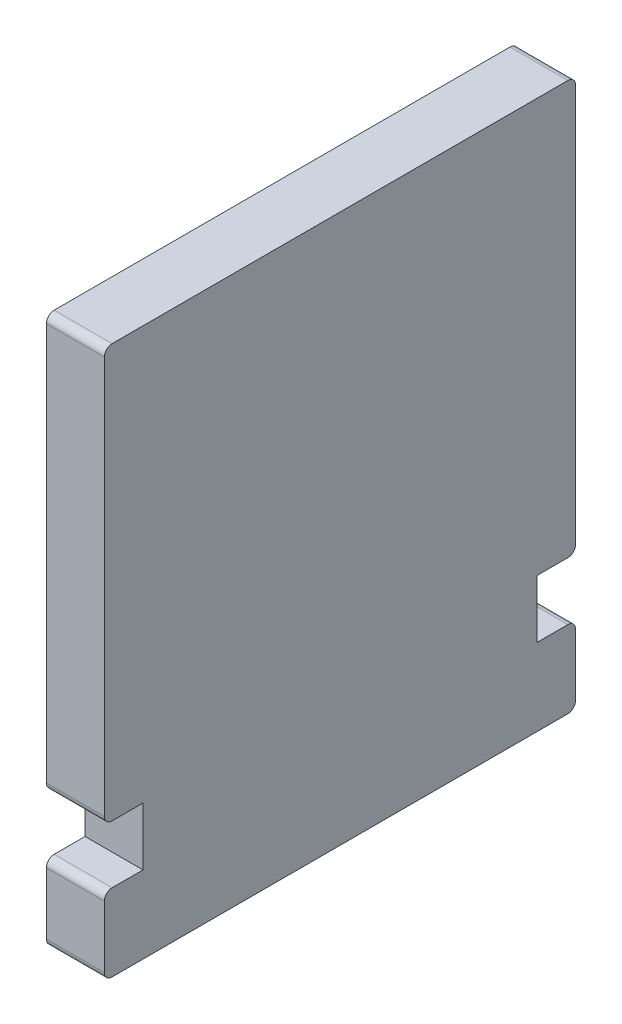
ISO-10303-21;
HEADER;
FILE_DESCRIPTION(('STEP AP214'),'2;1');
FILE_NAME('part.step','',(''),(''),'','','');
FILE_SCHEMA(('AUTOMOTIVE_DESIGN { 1 0 10303 214 1 1 1 1 }'));
ENDSEC;
DATA;
#1=APPLICATION_CONTEXT('core data for automotive mechanical design processes');
#2=APPLICATION_PROTOCOL_DEFINITION('international standard','automotive_design',2000,#1);
#3=PRODUCT_CONTEXT('',#1,'mechanical');
#4=PRODUCT('Part','Part','',(#3));
#5=PRODUCT_RELATED_PRODUCT_CATEGORY('part','',(#4));
#6=PRODUCT_DEFINITION_FORMATION('','',#4);
#7=PRODUCT_DEFINITION_CONTEXT('part definition',#1,'design');
#8=PRODUCT_DEFINITION('design','',#6,#7);
#9=PRODUCT_DEFINITION_SHAPE('','',#8);
#10=(LENGTH_UNIT() NAMED_UNIT(*) SI_UNIT(.MILLI.,.METRE.));
#11=(NAMED_UNIT(*) PLANE_ANGLE_UNIT() SI_UNIT($,.RADIAN.));
#12=(NAMED_UNIT(*) SI_UNIT($,.STERADIAN.) SOLID_ANGLE_UNIT());
#13=UNCERTAINTY_MEASURE_WITH_UNIT(LENGTH_MEASURE(1.E-05),#10,'distance_accuracy_value','');
#14=(GEOMETRIC_REPRESENTATION_CONTEXT(3) GLOBAL_UNCERTAINTY_ASSIGNED_CONTEXT((#13)) GLOBAL_UNIT_ASSIGNED_CONTEXT((#10,
#11,#12)) REPRESENTATION_CONTEXT('',''));
#15=CARTESIAN_POINT('',(0.,0.,0.));
#16=DIRECTION('',(0.,0.,1.));
#17=DIRECTION('',(1.,0.,0.));
#18=AXIS2_PLACEMENT_3D('',#15,#16,#17);
#19=CARTESIAN_POINT('',(0.,0.,0.));
#20=DIRECTION('',(0.,0.,-1.));
#21=DIRECTION('',(-1.,0.,0.));
#22=AXIS2_PLACEMENT_3D('',#19,#20,#21);
#23=PLANE('',#22);
#24=DIRECTION('',(0.,-1.,0.));
#25=VECTOR('',#24,1.);
#26=CARTESIAN_POINT('',(0.,0.,0.));
#27=LINE('',#26,#25);
#28=CARTESIAN_POINT('',(0.,14.,0.));
#29=VERTEX_POINT('',#28);
#30=CARTESIAN_POINT('',(0.,3.7,0.));
#31=VERTEX_POINT('',#30);
#32=EDGE_CURVE('E238',#29,#31,#27,.T.);
#33=ORIENTED_EDGE('',*,*,#32,.F.);
#34=DIRECTION('',(-1.,0.,0.));
#35=VECTOR('',#34,1.);
#36=CARTESIAN_POINT('',(1.5,14.,0.));
#37=LINE('',#36,#35);
#38=CARTESIAN_POINT('',(1.5,14.,0.));
#39=VERTEX_POINT('',#38);
#40=EDGE_CURVE('E276',#29,#39,#37,.F.);
#41=ORIENTED_EDGE('',*,*,#40,.T.);
#42=DIRECTION('',(0.,1.,0.));
#43=VECTOR('',#42,1.);
#44=CARTESIAN_POINT('',(1.5,0.,0.));
#45=LINE('',#44,#43);
#46=CARTESIAN_POINT('',(1.5,3.7,0.));
#47=VERTEX_POINT('',#46);
#48=EDGE_CURVE('E241',#47,#39,#45,.T.);
#49=ORIENTED_EDGE('',*,*,#48,.F.);
#50=DIRECTION('',(-1.,0.,0.));
#51=VECTOR('',#50,1.);
#52=CARTESIAN_POINT('',(0.,3.7,0.));
#53=LINE('',#52,#51);
#54=EDGE_CURVE('E273',#47,#31,#53,.T.);
#55=ORIENTED_EDGE('',*,*,#54,.T.);
#56=EDGE_LOOP('',(#33,#41,#49,#55));
#57=FACE_BOUND('',#56,.T.);
#58=ADVANCED_FACE('F35',(#57),#23,.T.);
#59=CARTESIAN_POINT('',(0.,0.,12.2));
#60=DIRECTION('',(0.,0.,-1.));
#61=DIRECTION('',(-1.,0.,0.));
#62=AXIS2_PLACEMENT_3D('',#59,#60,#61);
#63=PLANE('',#62);
#64=DIRECTION('',(0.,1.,0.));
#65=VECTOR('',#64,1.);
#66=CARTESIAN_POINT('',(1.5,0.,12.2));
#67=LINE('',#66,#65);
#68=CARTESIAN_POINT('',(1.5,3.7,12.2));
#69=VERTEX_POINT('',#68);
#70=CARTESIAN_POINT('',(1.5,14.,12.2));
#71=VERTEX_POINT('',#70);
#72=EDGE_CURVE('E230',#69,#71,#67,.T.);
#73=ORIENTED_EDGE('',*,*,#72,.T.);
#74=DIRECTION('',(-1.,0.,0.));
#75=VECTOR('',#74,1.);
#76=CARTESIAN_POINT('',(0.,14.,12.2));
#77=LINE('',#76,#75);
#78=CARTESIAN_POINT('',(0.,14.,12.2));
#79=VERTEX_POINT('',#78);
#80=EDGE_CURVE('E307',#71,#79,#77,.T.);
#81=ORIENTED_EDGE('',*,*,#80,.T.);
#82=DIRECTION('',(0.,-1.,0.));
#83=VECTOR('',#82,1.);
#84=CARTESIAN_POINT('',(0.,0.,12.2));
#85=LINE('',#84,#83);
#86=CARTESIAN_POINT('',(0.,3.7,12.2));
#87=VERTEX_POINT('',#86);
#88=EDGE_CURVE('E227',#79,#87,#85,.T.);
#89=ORIENTED_EDGE('',*,*,#88,.T.);
#90=DIRECTION('',(-1.,0.,0.));
#91=VECTOR('',#90,1.);
#92=CARTESIAN_POINT('',(0.,3.7,12.2));
#93=LINE('',#92,#91);
#94=EDGE_CURVE('E305',#87,#69,#93,.F.);
#95=ORIENTED_EDGE('',*,*,#94,.T.);
#96=EDGE_LOOP('',(#73,#81,#89,#95));
#97=FACE_BOUND('',#96,.T.);
#98=ADVANCED_FACE('F352',(#97),#63,.F.);
#99=CARTESIAN_POINT('',(0.,0.,12.2));
#100=DIRECTION('',(1.,0.,0.));
#101=DIRECTION('',(0.,0.,-1.));
#102=AXIS2_PLACEMENT_3D('',#99,#100,#101);
#103=PLANE('',#102);
#104=DIRECTION('',(0.,0.,-1.));
#105=VECTOR('',#104,1.);
#106=CARTESIAN_POINT('',(0.,14.2,12.2));
#107=LINE('',#106,#105);
#108=CARTESIAN_POINT('',(0.,14.2,12.));
#109=VERTEX_POINT('',#108);
#110=CARTESIAN_POINT('',(0.,14.2,0.200000000000001));
#111=VERTEX_POINT('',#110);
#112=EDGE_CURVE('E235',#109,#111,#107,.T.);
#113=ORIENTED_EDGE('',*,*,#112,.T.);
#114=CARTESIAN_POINT('',(0.,14.,0.200000000000001));
#115=DIRECTION('',(1.,0.,0.));
#116=DIRECTION('',(0.,0.,-1.));
#117=AXIS2_PLACEMENT_3D('',#114,#115,#116);
#118=CIRCLE('',#117,0.2);
#119=EDGE_CURVE('E271',#111,#29,#118,.F.);
#120=ORIENTED_EDGE('',*,*,#119,.T.);
#121=ORIENTED_EDGE('',*,*,#32,.T.);
#122=CARTESIAN_POINT('',(0.,3.7,0.2));
#123=DIRECTION('',(1.,0.,0.));
#124=DIRECTION('',(0.,0.,-1.));
#125=AXIS2_PLACEMENT_3D('',#122,#123,#124);
#126=CIRCLE('',#125,0.2);
#127=CARTESIAN_POINT('',(0.,3.5,0.2));
#128=VERTEX_POINT('',#127);
#129=EDGE_CURVE('E269',#31,#128,#126,.F.);
#130=ORIENTED_EDGE('',*,*,#129,.T.);
#131=DIRECTION('',(0.,0.,-1.));
#132=VECTOR('',#131,1.);
#133=CARTESIAN_POINT('',(0.,3.5,1.));
#134=LINE('',#133,#132);
#135=CARTESIAN_POINT('',(0.,3.5,1.));
#136=VERTEX_POINT('',#135);
#137=EDGE_CURVE('E197',#136,#128,#134,.T.);
#138=ORIENTED_EDGE('',*,*,#137,.F.);
#139=DIRECTION('',(0.,1.,0.));
#140=VECTOR('',#139,1.);
#141=CARTESIAN_POINT('',(0.,3.5,1.));
#142=LINE('',#141,#140);
#143=CARTESIAN_POINT('',(0.,2.,1.));
#144=VERTEX_POINT('',#143);
#145=EDGE_CURVE('E187',#144,#136,#142,.T.);
#146=ORIENTED_EDGE('',*,*,#145,.F.);
#147=DIRECTION('',(0.,0.,1.));
#148=VECTOR('',#147,1.);
#149=CARTESIAN_POINT('',(0.,2.,1.));
#150=LINE('',#149,#148);
#151=CARTESIAN_POINT('',(0.,2.,0.2));
#152=VERTEX_POINT('',#151);
#153=EDGE_CURVE('E172',#152,#144,#150,.T.);
#154=ORIENTED_EDGE('',*,*,#153,.F.);
#155=CARTESIAN_POINT('',(0.,1.8,0.2));
#156=DIRECTION('',(1.,0.,0.));
#157=DIRECTION('',(0.,0.,-1.));
#158=AXIS2_PLACEMENT_3D('',#155,#156,#157);
#159=CIRCLE('',#158,0.2);
#160=CARTESIAN_POINT('',(0.,1.8,0.));
#161=VERTEX_POINT('',#160);
#162=EDGE_CURVE('E267',#152,#161,#159,.F.);
#163=ORIENTED_EDGE('',*,*,#162,.T.);
#164=CARTESIAN_POINT('',(0.,0.2,0.));
#165=VERTEX_POINT('',#164);
#166=EDGE_CURVE('E226',#161,#165,#27,.T.);
#167=ORIENTED_EDGE('',*,*,#166,.T.);
#168=CARTESIAN_POINT('',(0.,0.2,0.200000000000001));
#169=DIRECTION('',(1.,0.,0.));
#170=DIRECTION('',(0.,0.,-1.));
#171=AXIS2_PLACEMENT_3D('',#168,#169,#170);
#172=CIRCLE('',#171,0.2);
#173=CARTESIAN_POINT('',(0.,0.,0.200000000000001));
#174=VERTEX_POINT('',#173);
#175=EDGE_CURVE('E265',#165,#174,#172,.F.);
#176=ORIENTED_EDGE('',*,*,#175,.T.);
#177=DIRECTION('',(0.,0.,-1.));
#178=VECTOR('',#177,1.);
#179=CARTESIAN_POINT('',(0.,0.,12.2));
#180=LINE('',#179,#178);
#181=CARTESIAN_POINT('',(0.,0.,12.));
#182=VERTEX_POINT('',#181);
#183=EDGE_CURVE('E249',#182,#174,#180,.T.);
#184=ORIENTED_EDGE('',*,*,#183,.F.);
#185=CARTESIAN_POINT('',(0.,0.2,12.));
#186=DIRECTION('',(1.,0.,0.));
#187=DIRECTION('',(0.,0.,-1.));
#188=AXIS2_PLACEMENT_3D('',#185,#186,#187);
#189=CIRCLE('',#188,0.2);
#190=CARTESIAN_POINT('',(0.,0.2,12.2));
#191=VERTEX_POINT('',#190);
#192=EDGE_CURVE('E257',#182,#191,#189,.F.);
#193=ORIENTED_EDGE('',*,*,#192,.T.);
#194=CARTESIAN_POINT('',(0.,1.8,12.2));
#195=VERTEX_POINT('',#194);
#196=EDGE_CURVE('E231',#195,#191,#85,.T.);
#197=ORIENTED_EDGE('',*,*,#196,.F.);
#198=CARTESIAN_POINT('',(0.,1.8,12.));
#199=DIRECTION('',(1.,0.,0.));
#200=DIRECTION('',(0.,0.,-1.));
#201=AXIS2_PLACEMENT_3D('',#198,#199,#200);
#202=CIRCLE('',#201,0.2);
#203=CARTESIAN_POINT('',(0.,2.,12.));
#204=VERTEX_POINT('',#203);
#205=EDGE_CURVE('E261',#195,#204,#202,.F.);
#206=ORIENTED_EDGE('',*,*,#205,.T.);
#207=DIRECTION('',(0.,0.,1.));
#208=VECTOR('',#207,1.);
#209=CARTESIAN_POINT('',(0.,2.,13.7974919074563));
#210=LINE('',#209,#208);
#211=CARTESIAN_POINT('',(0.,2.,11.2));
#212=VERTEX_POINT('',#211);
#213=EDGE_CURVE('E221',#212,#204,#210,.T.);
#214=ORIENTED_EDGE('',*,*,#213,.F.);
#215=DIRECTION('',(0.,-1.,0.));
#216=VECTOR('',#215,1.);
#217=CARTESIAN_POINT('',(0.,3.5,11.2));
#218=LINE('',#217,#216);
#219=CARTESIAN_POINT('',(0.,3.5,11.2));
#220=VERTEX_POINT('',#219);
#221=EDGE_CURVE('E181',#220,#212,#218,.T.);
#222=ORIENTED_EDGE('',*,*,#221,.F.);
#223=DIRECTION('',(0.,0.,-1.));
#224=VECTOR('',#223,1.);
#225=CARTESIAN_POINT('',(0.,3.5,13.7974919074563));
#226=LINE('',#225,#224);
#227=CARTESIAN_POINT('',(0.,3.5,12.));
#228=VERTEX_POINT('',#227);
#229=EDGE_CURVE('E208',#228,#220,#226,.T.);
#230=ORIENTED_EDGE('',*,*,#229,.F.);
#231=CARTESIAN_POINT('',(0.,3.7,12.));
#232=DIRECTION('',(1.,0.,0.));
#233=DIRECTION('',(0.,0.,-1.));
#234=AXIS2_PLACEMENT_3D('',#231,#232,#233);
#235=CIRCLE('',#234,0.2);
#236=EDGE_CURVE('E259',#228,#87,#235,.F.);
#237=ORIENTED_EDGE('',*,*,#236,.T.);
#238=ORIENTED_EDGE('',*,*,#88,.F.);
#239=CARTESIAN_POINT('',(0.,14.,12.));
#240=DIRECTION('',(1.,0.,0.));
#241=DIRECTION('',(0.,0.,-1.));
#242=AXIS2_PLACEMENT_3D('',#239,#240,#241);
#243=CIRCLE('',#242,0.2);
#244=EDGE_CURVE('E263',#79,#109,#243,.F.);
#245=ORIENTED_EDGE('',*,*,#244,.T.);
#246=EDGE_LOOP('',(#113,#120,#121,#130,#138,#146,#154,#163,#167,#176,#184,#193,#197,#206,#214,
#222,#230,#237,#238,#245));
#247=FACE_BOUND('',#246,.T.);
#248=ADVANCED_FACE('F195',(#247),#103,.F.);
#249=CARTESIAN_POINT('',(0.,0.,12.2));
#250=DIRECTION('',(0.,1.,0.));
#251=DIRECTION('',(0.,0.,1.));
#252=AXIS2_PLACEMENT_3D('',#249,#250,#251);
#253=PLANE('',#252);
#254=ORIENTED_EDGE('',*,*,#183,.T.);
#255=DIRECTION('',(1.,0.,0.));
#256=VECTOR('',#255,1.);
#257=CARTESIAN_POINT('',(1.5,0.,0.200000000000001));
#258=LINE('',#257,#256);
#259=CARTESIAN_POINT('',(1.5,0.,0.200000000000001));
#260=VERTEX_POINT('',#259);
#261=EDGE_CURVE('E302',#174,#260,#258,.T.);
#262=ORIENTED_EDGE('',*,*,#261,.T.);
#263=DIRECTION('',(0.,0.,-1.));
#264=VECTOR('',#263,1.);
#265=CARTESIAN_POINT('',(1.5,0.,12.2));
#266=LINE('',#265,#264);
#267=CARTESIAN_POINT('',(1.5,0.,12.));
#268=VERTEX_POINT('',#267);
#269=EDGE_CURVE('E246',#268,#260,#266,.T.);
#270=ORIENTED_EDGE('',*,*,#269,.F.);
#271=DIRECTION('',(1.,0.,0.));
#272=VECTOR('',#271,1.);
#273=CARTESIAN_POINT('',(0.,0.,12.));
#274=LINE('',#273,#272);
#275=EDGE_CURVE('E300',#268,#182,#274,.F.);
#276=ORIENTED_EDGE('',*,*,#275,.T.);
#277=EDGE_LOOP('',(#254,#262,#270,#276));
#278=FACE_BOUND('',#277,.T.);
#279=ADVANCED_FACE('F390',(#278),#253,.F.);
#280=CARTESIAN_POINT('',(1.5,0.,12.2));
#281=DIRECTION('',(-1.,0.,0.));
#282=DIRECTION('',(0.,0.,1.));
#283=AXIS2_PLACEMENT_3D('',#280,#281,#282);
#284=PLANE('',#283);
#285=ORIENTED_EDGE('',*,*,#48,.T.);
#286=CARTESIAN_POINT('',(1.5,14.,0.200000000000001));
#287=DIRECTION('',(-1.,0.,0.));
#288=DIRECTION('',(0.,0.,1.));
#289=AXIS2_PLACEMENT_3D('',#286,#287,#288);
#290=CIRCLE('',#289,0.2);
#291=CARTESIAN_POINT('',(1.5,14.2,0.200000000000001));
#292=VERTEX_POINT('',#291);
#293=EDGE_CURVE('E291',#39,#292,#290,.F.);
#294=ORIENTED_EDGE('',*,*,#293,.T.);
#295=DIRECTION('',(0.,0.,-1.));
#296=VECTOR('',#295,1.);
#297=CARTESIAN_POINT('',(1.5,14.2,12.2));
#298=LINE('',#297,#296);
#299=CARTESIAN_POINT('',(1.5,14.2,12.));
#300=VERTEX_POINT('',#299);
#301=EDGE_CURVE('E243',#300,#292,#298,.T.);
#302=ORIENTED_EDGE('',*,*,#301,.F.);
#303=CARTESIAN_POINT('',(1.5,14.,12.));
#304=DIRECTION('',(-1.,0.,0.));
#305=DIRECTION('',(0.,0.,1.));
#306=AXIS2_PLACEMENT_3D('',#303,#304,#305);
#307=CIRCLE('',#306,0.2);
#308=EDGE_CURVE('E284',#300,#71,#307,.F.);
#309=ORIENTED_EDGE('',*,*,#308,.T.);
#310=ORIENTED_EDGE('',*,*,#72,.F.);
#311=CARTESIAN_POINT('',(1.5,3.7,12.));
#312=DIRECTION('',(-1.,0.,0.));
#313=DIRECTION('',(0.,0.,1.));
#314=AXIS2_PLACEMENT_3D('',#311,#312,#313);
#315=CIRCLE('',#314,0.2);
#316=CARTESIAN_POINT('',(1.5,3.5,12.));
#317=VERTEX_POINT('',#316);
#318=EDGE_CURVE('E280',#69,#317,#315,.F.);
#319=ORIENTED_EDGE('',*,*,#318,.T.);
#320=DIRECTION('',(0.,0.,1.));
#321=VECTOR('',#320,1.);
#322=CARTESIAN_POINT('',(1.5,3.5,13.7974919074563));
#323=LINE('',#322,#321);
#324=CARTESIAN_POINT('',(1.5,3.5,11.2));
#325=VERTEX_POINT('',#324);
#326=EDGE_CURVE('E215',#325,#317,#323,.T.);
#327=ORIENTED_EDGE('',*,*,#326,.F.);
#328=DIRECTION('',(0.,1.,0.));
#329=VECTOR('',#328,1.);
#330=CARTESIAN_POINT('',(1.5,3.5,11.2));
#331=LINE('',#330,#329);
#332=CARTESIAN_POINT('',(1.5,2.,11.2));
#333=VERTEX_POINT('',#332);
#334=EDGE_CURVE('E212',#333,#325,#331,.T.);
#335=ORIENTED_EDGE('',*,*,#334,.F.);
#336=DIRECTION('',(0.,0.,-1.));
#337=VECTOR('',#336,1.);
#338=CARTESIAN_POINT('',(1.5,2.,13.7974919074563));
#339=LINE('',#338,#337);
#340=CARTESIAN_POINT('',(1.5,2.,12.));
#341=VERTEX_POINT('',#340);
#342=EDGE_CURVE('E210',#341,#333,#339,.T.);
#343=ORIENTED_EDGE('',*,*,#342,.F.);
#344=CARTESIAN_POINT('',(1.5,1.8,12.));
#345=DIRECTION('',(-1.,0.,0.));
#346=DIRECTION('',(0.,0.,1.));
#347=AXIS2_PLACEMENT_3D('',#344,#345,#346);
#348=CIRCLE('',#347,0.2);
#349=CARTESIAN_POINT('',(1.5,1.8,12.2));
#350=VERTEX_POINT('',#349);
#351=EDGE_CURVE('E282',#341,#350,#348,.F.);
#352=ORIENTED_EDGE('',*,*,#351,.T.);
#353=CARTESIAN_POINT('',(1.5,0.2,12.2));
#354=VERTEX_POINT('',#353);
#355=EDGE_CURVE('E232',#354,#350,#67,.T.);
#356=ORIENTED_EDGE('',*,*,#355,.F.);
#357=CARTESIAN_POINT('',(1.5,0.2,12.));
#358=DIRECTION('',(-1.,0.,0.));
#359=DIRECTION('',(0.,0.,1.));
#360=AXIS2_PLACEMENT_3D('',#357,#358,#359);
#361=CIRCLE('',#360,0.2);
#362=EDGE_CURVE('E278',#354,#268,#361,.F.);
#363=ORIENTED_EDGE('',*,*,#362,.T.);
#364=ORIENTED_EDGE('',*,*,#269,.T.);
#365=CARTESIAN_POINT('',(1.5,0.2,0.200000000000001));
#366=DIRECTION('',(-1.,0.,0.));
#367=DIRECTION('',(0.,0.,1.));
#368=AXIS2_PLACEMENT_3D('',#365,#366,#367);
#369=CIRCLE('',#368,0.2);
#370=CARTESIAN_POINT('',(1.5,0.2,0.));
#371=VERTEX_POINT('',#370);
#372=EDGE_CURVE('E286',#260,#371,#369,.F.);
#373=ORIENTED_EDGE('',*,*,#372,.T.);
#374=CARTESIAN_POINT('',(1.5,1.8,0.));
#375=VERTEX_POINT('',#374);
#376=EDGE_CURVE('E239',#371,#375,#45,.T.);
#377=ORIENTED_EDGE('',*,*,#376,.T.);
#378=CARTESIAN_POINT('',(1.5,1.8,0.2));
#379=DIRECTION('',(-1.,0.,0.));
#380=DIRECTION('',(0.,0.,1.));
#381=AXIS2_PLACEMENT_3D('',#378,#379,#380);
#382=CIRCLE('',#381,0.2);
#383=CARTESIAN_POINT('',(1.5,2.,0.2));
#384=VERTEX_POINT('',#383);
#385=EDGE_CURVE('E50',#375,#384,#382,.F.);
#386=ORIENTED_EDGE('',*,*,#385,.T.);
#387=DIRECTION('',(0.,0.,-1.));
#388=VECTOR('',#387,1.);
#389=CARTESIAN_POINT('',(1.5,2.,1.));
#390=LINE('',#389,#388);
#391=CARTESIAN_POINT('',(1.5,2.,1.));
#392=VERTEX_POINT('',#391);
#393=EDGE_CURVE('E202',#392,#384,#390,.T.);
#394=ORIENTED_EDGE('',*,*,#393,.F.);
#395=DIRECTION('',(0.,-1.,0.));
#396=VECTOR('',#395,1.);
#397=CARTESIAN_POINT('',(1.5,3.5,1.));
#398=LINE('',#397,#396);
#399=CARTESIAN_POINT('',(1.5,3.5,1.));
#400=VERTEX_POINT('',#399);
#401=EDGE_CURVE('E190',#400,#392,#398,.T.);
#402=ORIENTED_EDGE('',*,*,#401,.F.);
#403=DIRECTION('',(0.,0.,1.));
#404=VECTOR('',#403,1.);
#405=CARTESIAN_POINT('',(1.5,3.5,1.));
#406=LINE('',#405,#404);
#407=CARTESIAN_POINT('',(1.5,3.5,0.2));
#408=VERTEX_POINT('',#407);
#409=EDGE_CURVE('E191',#408,#400,#406,.T.);
#410=ORIENTED_EDGE('',*,*,#409,.F.);
#411=CARTESIAN_POINT('',(1.5,3.7,0.2));
#412=DIRECTION('',(-1.,0.,0.));
#413=DIRECTION('',(0.,0.,1.));
#414=AXIS2_PLACEMENT_3D('',#411,#412,#413);
#415=CIRCLE('',#414,0.2);
#416=EDGE_CURVE('E289',#408,#47,#415,.F.);
#417=ORIENTED_EDGE('',*,*,#416,.T.);
#418=EDGE_LOOP('',(#285,#294,#302,#309,#310,#319,#327,#335,#343,#352,#356,#363,#364,#373,#377,
#386,#394,#402,#410,#417));
#419=FACE_BOUND('',#418,.T.);
#420=ADVANCED_FACE('F334',(#419),#284,.F.);
#421=CARTESIAN_POINT('',(0.,14.2,12.2));
#422=DIRECTION('',(0.,-1.,0.));
#423=DIRECTION('',(0.,0.,-1.));
#424=AXIS2_PLACEMENT_3D('',#421,#422,#423);
#425=PLANE('',#424);
#426=ORIENTED_EDGE('',*,*,#301,.T.);
#427=DIRECTION('',(-1.,0.,0.));
#428=VECTOR('',#427,1.);
#429=CARTESIAN_POINT('',(0.,14.2,0.200000000000001));
#430=LINE('',#429,#428);
#431=EDGE_CURVE('E254',#292,#111,#430,.T.);
#432=ORIENTED_EDGE('',*,*,#431,.T.);
#433=ORIENTED_EDGE('',*,*,#112,.F.);
#434=DIRECTION('',(-1.,0.,0.));
#435=VECTOR('',#434,1.);
#436=CARTESIAN_POINT('',(0.,14.2,12.));
#437=LINE('',#436,#435);
#438=EDGE_CURVE('E252',#109,#300,#437,.F.);
#439=ORIENTED_EDGE('',*,*,#438,.T.);
#440=EDGE_LOOP('',(#426,#432,#433,#439));
#441=FACE_BOUND('',#440,.T.);
#442=ADVANCED_FACE('F361',(#441),#425,.F.);
#443=ORIENTED_EDGE('',*,*,#355,.T.);
#444=DIRECTION('',(1.,0.,0.));
#445=VECTOR('',#444,1.);
#446=CARTESIAN_POINT('',(0.,1.8,12.2));
#447=LINE('',#446,#445);
#448=EDGE_CURVE('E43',#350,#195,#447,.F.);
#449=ORIENTED_EDGE('',*,*,#448,.T.);
#450=ORIENTED_EDGE('',*,*,#196,.T.);
#451=DIRECTION('',(1.,0.,0.));
#452=VECTOR('',#451,1.);
#453=CARTESIAN_POINT('',(0.,0.2,12.2));
#454=LINE('',#453,#452);
#455=EDGE_CURVE('E313',#191,#354,#454,.T.);
#456=ORIENTED_EDGE('',*,*,#455,.T.);
#457=EDGE_LOOP('',(#443,#449,#450,#456));
#458=FACE_BOUND('',#457,.T.);
#459=ADVANCED_FACE('F319',(#458),#63,.F.);
#460=ORIENTED_EDGE('',*,*,#166,.F.);
#461=DIRECTION('',(1.,0.,0.));
#462=VECTOR('',#461,1.);
#463=CARTESIAN_POINT('',(1.5,1.8,0.));
#464=LINE('',#463,#462);
#465=EDGE_CURVE('E297',#161,#375,#464,.T.);
#466=ORIENTED_EDGE('',*,*,#465,.T.);
#467=ORIENTED_EDGE('',*,*,#376,.F.);
#468=DIRECTION('',(1.,0.,0.));
#469=VECTOR('',#468,1.);
#470=CARTESIAN_POINT('',(0.,0.2,0.));
#471=LINE('',#470,#469);
#472=EDGE_CURVE('E295',#371,#165,#471,.F.);
#473=ORIENTED_EDGE('',*,*,#472,.T.);
#474=EDGE_LOOP('',(#460,#466,#467,#473));
#475=FACE_BOUND('',#474,.T.);
#476=ADVANCED_FACE('F383',(#475),#23,.T.);
#477=CARTESIAN_POINT('',(-0.000999999999999916,3.5,13.7974919074563));
#478=DIRECTION('',(0.,1.,0.));
#479=DIRECTION('',(0.,0.,1.));
#480=AXIS2_PLACEMENT_3D('',#477,#478,#479);
#481=PLANE('',#480);
#482=ORIENTED_EDGE('',*,*,#326,.T.);
#483=DIRECTION('',(-1.,0.,0.));
#484=VECTOR('',#483,1.);
#485=CARTESIAN_POINT('',(-0.000999999999999916,3.5,12.));
#486=LINE('',#485,#484);
#487=EDGE_CURVE('E11',#317,#228,#486,.T.);
#488=ORIENTED_EDGE('',*,*,#487,.T.);
#489=ORIENTED_EDGE('',*,*,#229,.T.);
#490=DIRECTION('',(1.,0.,0.));
#491=VECTOR('',#490,1.);
#492=CARTESIAN_POINT('',(-0.000999999999999916,3.5,11.2));
#493=LINE('',#492,#491);
#494=EDGE_CURVE('E219',#220,#325,#493,.T.);
#495=ORIENTED_EDGE('',*,*,#494,.T.);
#496=EDGE_LOOP('',(#482,#488,#489,#495));
#497=FACE_BOUND('',#496,.T.);
#498=ADVANCED_FACE('F343',(#497),#481,.F.);
#499=CARTESIAN_POINT('',(-0.000999999999999916,3.5,11.2));
#500=DIRECTION('',(0.,0.,-1.));
#501=DIRECTION('',(-1.,0.,0.));
#502=AXIS2_PLACEMENT_3D('',#499,#500,#501);
#503=PLANE('',#502);
#504=ORIENTED_EDGE('',*,*,#221,.T.);
#505=DIRECTION('',(1.,0.,0.));
#506=VECTOR('',#505,1.);
#507=CARTESIAN_POINT('',(-0.000999999999999916,2.,11.2));
#508=LINE('',#507,#506);
#509=EDGE_CURVE('E218',#212,#333,#508,.T.);
#510=ORIENTED_EDGE('',*,*,#509,.T.);
#511=ORIENTED_EDGE('',*,*,#334,.T.);
#512=ORIENTED_EDGE('',*,*,#494,.F.);
#513=EDGE_LOOP('',(#504,#510,#511,#512));
#514=FACE_BOUND('',#513,.T.);
#515=ADVANCED_FACE('F338',(#514),#503,.F.);
#516=CARTESIAN_POINT('',(-0.000999999999999916,2.,13.7974919074563));
#517=DIRECTION('',(0.,-1.,0.));
#518=DIRECTION('',(0.,0.,-1.));
#519=AXIS2_PLACEMENT_3D('',#516,#517,#518);
#520=PLANE('',#519);
#521=ORIENTED_EDGE('',*,*,#213,.T.);
#522=DIRECTION('',(1.,0.,0.));
#523=VECTOR('',#522,1.);
#524=CARTESIAN_POINT('',(-0.000999999999999916,2.,12.));
#525=LINE('',#524,#523);
#526=EDGE_CURVE('E310',#204,#341,#525,.T.);
#527=ORIENTED_EDGE('',*,*,#526,.T.);
#528=ORIENTED_EDGE('',*,*,#342,.T.);
#529=ORIENTED_EDGE('',*,*,#509,.F.);
#530=EDGE_LOOP('',(#521,#527,#528,#529));
#531=FACE_BOUND('',#530,.T.);
#532=ADVANCED_FACE('F331',(#531),#520,.F.);
#533=CARTESIAN_POINT('',(-0.000999999999999916,3.5,1.));
#534=DIRECTION('',(0.,0.,1.));
#535=DIRECTION('',(0.,-1.,0.));
#536=AXIS2_PLACEMENT_3D('',#533,#534,#535);
#537=PLANE('',#536);
#538=ORIENTED_EDGE('',*,*,#145,.T.);
#539=DIRECTION('',(1.,0.,0.));
#540=VECTOR('',#539,1.);
#541=CARTESIAN_POINT('',(-0.000999999999999916,3.5,1.));
#542=LINE('',#541,#540);
#543=EDGE_CURVE('E182',#136,#400,#542,.T.);
#544=ORIENTED_EDGE('',*,*,#543,.T.);
#545=ORIENTED_EDGE('',*,*,#401,.T.);
#546=DIRECTION('',(1.,0.,0.));
#547=VECTOR('',#546,1.);
#548=CARTESIAN_POINT('',(-0.000999999999999916,2.,1.));
#549=LINE('',#548,#547);
#550=EDGE_CURVE('E175',#144,#392,#549,.T.);
#551=ORIENTED_EDGE('',*,*,#550,.F.);
#552=EDGE_LOOP('',(#538,#544,#545,#551));
#553=FACE_BOUND('',#552,.T.);
#554=ADVANCED_FACE('F185',(#553),#537,.F.);
#555=CARTESIAN_POINT('',(-0.000999999999999916,3.5,1.));
#556=DIRECTION('',(0.,1.,0.));
#557=DIRECTION('',(0.,0.,1.));
#558=AXIS2_PLACEMENT_3D('',#555,#556,#557);
#559=PLANE('',#558);
#560=ORIENTED_EDGE('',*,*,#137,.T.);
#561=DIRECTION('',(-1.,0.,0.));
#562=VECTOR('',#561,1.);
#563=CARTESIAN_POINT('',(1.5,3.5,0.2));
#564=LINE('',#563,#562);
#565=EDGE_CURVE('E293',#128,#408,#564,.F.);
#566=ORIENTED_EDGE('',*,*,#565,.T.);
#567=ORIENTED_EDGE('',*,*,#409,.T.);
#568=ORIENTED_EDGE('',*,*,#543,.F.);
#569=EDGE_LOOP('',(#560,#566,#567,#568));
#570=FACE_BOUND('',#569,.T.);
#571=ADVANCED_FACE('F378',(#570),#559,.F.);
#572=CARTESIAN_POINT('',(-0.000999999999999916,2.,1.));
#573=DIRECTION('',(0.,-1.,0.));
#574=DIRECTION('',(0.,0.,-1.));
#575=AXIS2_PLACEMENT_3D('',#572,#573,#574);
#576=PLANE('',#575);
#577=ORIENTED_EDGE('',*,*,#393,.T.);
#578=DIRECTION('',(1.,0.,0.));
#579=VECTOR('',#578,1.);
#580=CARTESIAN_POINT('',(0.,2.,0.2));
#581=LINE('',#580,#579);
#582=EDGE_CURVE('E177',#384,#152,#581,.F.);
#583=ORIENTED_EDGE('',*,*,#582,.T.);
#584=ORIENTED_EDGE('',*,*,#153,.T.);
#585=ORIENTED_EDGE('',*,*,#550,.T.);
#586=EDGE_LOOP('',(#577,#583,#584,#585));
#587=FACE_BOUND('',#586,.T.);
#588=ADVANCED_FACE('F174',(#587),#576,.F.);
#589=CARTESIAN_POINT('',(0.,14.,0.200000000000001));
#590=DIRECTION('',(1.,0.,0.));
#591=DIRECTION('',(0.,0.,-1.));
#592=AXIS2_PLACEMENT_3D('',#589,#590,#591);
#593=CYLINDRICAL_SURFACE('',#592,0.2);
#594=ORIENTED_EDGE('',*,*,#293,.F.);
#595=ORIENTED_EDGE('',*,*,#40,.F.);
#596=ORIENTED_EDGE('',*,*,#119,.F.);
#597=ORIENTED_EDGE('',*,*,#431,.F.);
#598=EDGE_LOOP('',(#594,#595,#596,#597));
#599=FACE_BOUND('',#598,.T.);
#600=ADVANCED_FACE('F365',(#599),#593,.T.);
#601=CARTESIAN_POINT('',(0.,3.7,0.2));
#602=DIRECTION('',(1.,0.,0.));
#603=DIRECTION('',(0.,0.,-1.));
#604=AXIS2_PLACEMENT_3D('',#601,#602,#603);
#605=CYLINDRICAL_SURFACE('',#604,0.2);
#606=ORIENTED_EDGE('',*,*,#416,.F.);
#607=ORIENTED_EDGE('',*,*,#565,.F.);
#608=ORIENTED_EDGE('',*,*,#129,.F.);
#609=ORIENTED_EDGE('',*,*,#54,.F.);
#610=EDGE_LOOP('',(#606,#607,#608,#609));
#611=FACE_BOUND('',#610,.T.);
#612=ADVANCED_FACE('F375',(#611),#605,.T.);
#613=CARTESIAN_POINT('',(0.,1.8,0.2));
#614=DIRECTION('',(-1.,0.,0.));
#615=DIRECTION('',(0.,0.,1.));
#616=AXIS2_PLACEMENT_3D('',#613,#614,#615);
#617=CYLINDRICAL_SURFACE('',#616,0.2);
#618=ORIENTED_EDGE('',*,*,#162,.F.);
#619=ORIENTED_EDGE('',*,*,#582,.F.);
#620=ORIENTED_EDGE('',*,*,#385,.F.);
#621=ORIENTED_EDGE('',*,*,#465,.F.);
#622=EDGE_LOOP('',(#618,#619,#620,#621));
#623=FACE_BOUND('',#622,.T.);
#624=ADVANCED_FACE('F379',(#623),#617,.T.);
#625=CARTESIAN_POINT('',(0.,0.2,0.200000000000001));
#626=DIRECTION('',(-1.,0.,0.));
#627=DIRECTION('',(0.,0.,1.));
#628=AXIS2_PLACEMENT_3D('',#625,#626,#627);
#629=CYLINDRICAL_SURFACE('',#628,0.2);
#630=ORIENTED_EDGE('',*,*,#175,.F.);
#631=ORIENTED_EDGE('',*,*,#472,.F.);
#632=ORIENTED_EDGE('',*,*,#372,.F.);
#633=ORIENTED_EDGE('',*,*,#261,.F.);
#634=EDGE_LOOP('',(#630,#631,#632,#633));
#635=FACE_BOUND('',#634,.T.);
#636=ADVANCED_FACE('F387',(#635),#629,.T.);
#637=CARTESIAN_POINT('',(0.,14.,12.));
#638=DIRECTION('',(-1.,0.,0.));
#639=DIRECTION('',(0.,0.,1.));
#640=AXIS2_PLACEMENT_3D('',#637,#638,#639);
#641=CYLINDRICAL_SURFACE('',#640,0.2);
#642=ORIENTED_EDGE('',*,*,#308,.F.);
#643=ORIENTED_EDGE('',*,*,#438,.F.);
#644=ORIENTED_EDGE('',*,*,#244,.F.);
#645=ORIENTED_EDGE('',*,*,#80,.F.);
#646=EDGE_LOOP('',(#642,#643,#644,#645));
#647=FACE_BOUND('',#646,.T.);
#648=ADVANCED_FACE('F358',(#647),#641,.T.);
#649=CARTESIAN_POINT('',(-0.000999999999999916,1.8,12.));
#650=DIRECTION('',(1.,0.,0.));
#651=DIRECTION('',(0.,0.,-1.));
#652=AXIS2_PLACEMENT_3D('',#649,#650,#651);
#653=CYLINDRICAL_SURFACE('',#652,0.2);
#654=ORIENTED_EDGE('',*,*,#205,.F.);
#655=ORIENTED_EDGE('',*,*,#448,.F.);
#656=ORIENTED_EDGE('',*,*,#351,.F.);
#657=ORIENTED_EDGE('',*,*,#526,.F.);
#658=EDGE_LOOP('',(#654,#655,#656,#657));
#659=FACE_BOUND('',#658,.T.);
#660=ADVANCED_FACE('F328',(#659),#653,.T.);
#661=CARTESIAN_POINT('',(-0.000999999999999916,3.7,12.));
#662=DIRECTION('',(-1.,0.,0.));
#663=DIRECTION('',(0.,0.,1.));
#664=AXIS2_PLACEMENT_3D('',#661,#662,#663);
#665=CYLINDRICAL_SURFACE('',#664,0.2);
#666=ORIENTED_EDGE('',*,*,#318,.F.);
#667=ORIENTED_EDGE('',*,*,#94,.F.);
#668=ORIENTED_EDGE('',*,*,#236,.F.);
#669=ORIENTED_EDGE('',*,*,#487,.F.);
#670=EDGE_LOOP('',(#666,#667,#668,#669));
#671=FACE_BOUND('',#670,.T.);
#672=ADVANCED_FACE('F347',(#671),#665,.T.);
#673=CARTESIAN_POINT('',(0.,0.2,12.));
#674=DIRECTION('',(1.,0.,0.));
#675=DIRECTION('',(0.,0.,-1.));
#676=AXIS2_PLACEMENT_3D('',#673,#674,#675);
#677=CYLINDRICAL_SURFACE('',#676,0.2);
#678=ORIENTED_EDGE('',*,*,#192,.F.);
#679=ORIENTED_EDGE('',*,*,#275,.F.);
#680=ORIENTED_EDGE('',*,*,#362,.F.);
#681=ORIENTED_EDGE('',*,*,#455,.F.);
#682=EDGE_LOOP('',(#678,#679,#680,#681));
#683=FACE_BOUND('',#682,.T.);
#684=ADVANCED_FACE('F37',(#683),#677,.T.);
#685=CLOSED_SHELL('',(#58,#98,#248,#279,#420,#442,#459,#476,#498,#515,#532,#554,#571,#588,#600,
#612,#624,#636,#648,#660,#672,#684));
#686=MANIFOLD_SOLID_BREP('B2',#685);
#687=ADVANCED_BREP_SHAPE_REPRESENTATION('',(#18,#686),#14);
#688=SHAPE_DEFINITION_REPRESENTATION(#9,#687);
ENDSEC;
END-ISO-10303-21;
